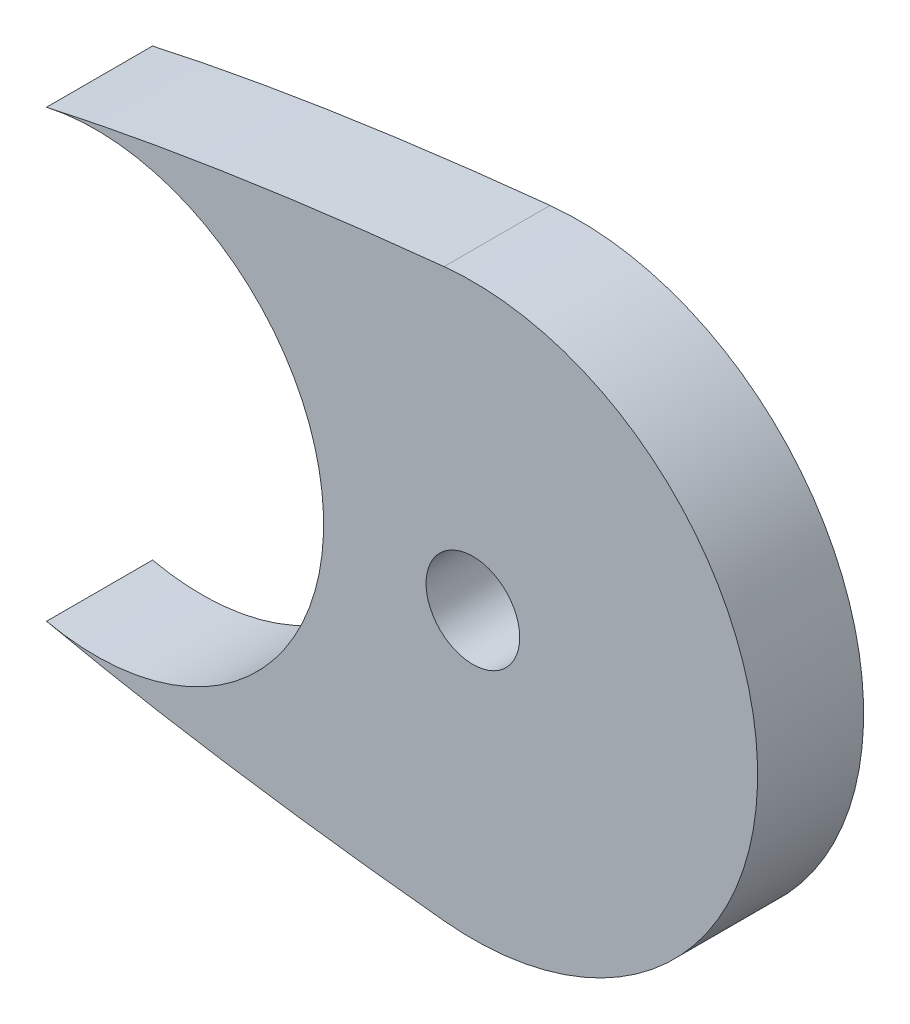
ISO-10303-21;
HEADER;
FILE_DESCRIPTION(('STEP AP214'),'2;1');
FILE_NAME('part.step','',(''),(''),'','','');
FILE_SCHEMA(('AUTOMOTIVE_DESIGN { 1 0 10303 214 1 1 1 1 }'));
ENDSEC;
DATA;
#1=APPLICATION_CONTEXT('core data for automotive mechanical design processes');
#2=APPLICATION_PROTOCOL_DEFINITION('international standard','automotive_design',2000,#1);
#3=PRODUCT_CONTEXT('',#1,'mechanical');
#4=PRODUCT('Part','Part','',(#3));
#5=PRODUCT_RELATED_PRODUCT_CATEGORY('part','',(#4));
#6=PRODUCT_DEFINITION_FORMATION('','',#4);
#7=PRODUCT_DEFINITION_CONTEXT('part definition',#1,'design');
#8=PRODUCT_DEFINITION('design','',#6,#7);
#9=PRODUCT_DEFINITION_SHAPE('','',#8);
#10=(LENGTH_UNIT() NAMED_UNIT(*) SI_UNIT(.MILLI.,.METRE.));
#11=(NAMED_UNIT(*) PLANE_ANGLE_UNIT() SI_UNIT($,.RADIAN.));
#12=(NAMED_UNIT(*) SI_UNIT($,.STERADIAN.) SOLID_ANGLE_UNIT());
#13=UNCERTAINTY_MEASURE_WITH_UNIT(LENGTH_MEASURE(1.E-05),#10,'distance_accuracy_value','');
#14=(GEOMETRIC_REPRESENTATION_CONTEXT(3) GLOBAL_UNCERTAINTY_ASSIGNED_CONTEXT((#13)) GLOBAL_UNIT_ASSIGNED_CONTEXT((#10,
#11,#12)) REPRESENTATION_CONTEXT('',''));
#15=CARTESIAN_POINT('',(0.,0.,0.));
#16=DIRECTION('',(0.,0.,1.));
#17=DIRECTION('',(1.,0.,0.));
#18=AXIS2_PLACEMENT_3D('',#15,#16,#17);
#19=CARTESIAN_POINT('',(46.6322388953236,0.,6.));
#20=DIRECTION('',(0.,0.,-1.));
#21=DIRECTION('',(-1.,0.,0.));
#22=AXIS2_PLACEMENT_3D('',#19,#20,#21);
#23=CYLINDRICAL_SURFACE('',#22,16.1182550375673);
#24=CARTESIAN_POINT('',(46.6322388953236,0.,0.));
#25=DIRECTION('',(0.,0.,1.));
#26=DIRECTION('',(1.,0.,0.));
#27=AXIS2_PLACEMENT_3D('',#24,#25,#26);
#28=CIRCLE('',#27,16.1182550375673);
#29=CARTESIAN_POINT('',(45.,-16.0353965228383,0.));
#30=VERTEX_POINT('',#29);
#31=CARTESIAN_POINT('',(45.,16.0353965228383,0.));
#32=VERTEX_POINT('',#31);
#33=EDGE_CURVE('E141',#30,#32,#28,.T.);
#34=ORIENTED_EDGE('',*,*,#33,.T.);
#35=DIRECTION('',(0.,0.,-1.));
#36=VECTOR('',#35,1.);
#37=CARTESIAN_POINT('',(45.,16.0353965228383,6.));
#38=LINE('',#37,#36);
#39=CARTESIAN_POINT('',(45.,16.0353965228383,6.));
#40=VERTEX_POINT('',#39);
#41=EDGE_CURVE('E11',#40,#32,#38,.T.);
#42=ORIENTED_EDGE('',*,*,#41,.F.);
#43=CARTESIAN_POINT('',(46.6322388953236,0.,6.));
#44=DIRECTION('',(0.,0.,1.));
#45=DIRECTION('',(1.,0.,0.));
#46=AXIS2_PLACEMENT_3D('',#43,#44,#45);
#47=CIRCLE('',#46,16.1182550375673);
#48=CARTESIAN_POINT('',(45.,-16.0353965228383,6.));
#49=VERTEX_POINT('',#48);
#50=EDGE_CURVE('E98',#49,#40,#47,.T.);
#51=ORIENTED_EDGE('',*,*,#50,.F.);
#52=DIRECTION('',(0.,0.,-1.));
#53=VECTOR('',#52,1.);
#54=CARTESIAN_POINT('',(45.,-16.0353965228383,6.));
#55=LINE('',#54,#53);
#56=EDGE_CURVE('E142',#49,#30,#55,.T.);
#57=ORIENTED_EDGE('',*,*,#56,.T.);
#58=EDGE_LOOP('',(#34,#42,#51,#57));
#59=FACE_BOUND('',#58,.T.);
#60=ADVANCED_FACE('F45',(#59),#23,.T.);
#61=CARTESIAN_POINT('',(300.,0.378,6.));
#62=CARTESIAN_POINT('',(299.845901447221,0.39961034336831,6.));
#63=CARTESIAN_POINT('',(299.230346714046,0.48593399083917,6.));
#64=CARTESIAN_POINT('',(297.848901683276,0.678531057447331,6.));
#65=CARTESIAN_POINT('',(295.556029122455,0.996787499241564,6.));
#66=CARTESIAN_POINT('',(292.365739581197,1.43343203295321,6.));
#67=CARTESIAN_POINT('',(288.297856433401,1.98344889126347,6.));
#68=CARTESIAN_POINT('',(283.377248038078,2.63572648359042,6.));
#69=CARTESIAN_POINT('',(277.63430498472,3.38149178862329,6.));
#70=CARTESIAN_POINT('',(271.104515413466,4.20901604095742,6.));
#71=CARTESIAN_POINT('',(263.828064626846,5.10718872872647,6.));
#72=CARTESIAN_POINT('',(255.849823781818,6.06276893212352,6.));
#73=CARTESIAN_POINT('',(247.21903434379,7.06424307195608,6.));
#74=CARTESIAN_POINT('',(237.988783489903,8.09787318806774,6.));
#75=CARTESIAN_POINT('',(228.216029511608,9.15107036010328,6.));
#76=CARTESIAN_POINT('',(217.961088379031,10.2107446574668,6.));
#77=CARTESIAN_POINT('',(207.287161839572,11.2632209265187,6.));
#78=CARTESIAN_POINT('',(196.260086850424,12.2937248064858,6.));
#79=CARTESIAN_POINT('',(184.947773044503,13.2887281219597,6.));
#80=CARTESIAN_POINT('',(173.420088229148,14.2315961384787,6.));
#81=CARTESIAN_POINT('',(161.747864995533,15.1069553720124,6.));
#82=CARTESIAN_POINT('',(150.00317252135,15.8985540753976,6.));
#83=CARTESIAN_POINT('',(138.258374542497,16.5898406039741,6.));
#84=CARTESIAN_POINT('',(126.585774705795,17.1633504747405,6.));
#85=CARTESIAN_POINT('',(115.057462615139,17.6037905135667,6.));
#86=CARTESIAN_POINT('',(103.744181572864,17.8967919128621,6.));
#87=CARTESIAN_POINT('',(92.7158453472272,18.0280433746414,6.));
#88=CARTESIAN_POINT('',(82.0402185013839,17.9871287273908,6.));
#89=CARTESIAN_POINT('',(71.7831190583338,17.7661449762132,6.));
#90=CARTESIAN_POINT('',(62.0076841473254,17.3594904245971,6.));
#91=CARTESIAN_POINT('',(52.7740834437817,16.7661013276277,6.));
#92=CARTESIAN_POINT('',(44.1390669938569,15.987763153894,6.));
#93=CARTESIAN_POINT('',(36.1554749512941,15.0305547578774,6.));
#94=CARTESIAN_POINT('',(28.8719698679608,13.9026205663682,6.));
#95=CARTESIAN_POINT('',(22.3326880228315,12.6157408879695,6.));
#96=CARTESIAN_POINT('',(16.5759570466198,11.1844668147641,6.));
#97=CARTESIAN_POINT('',(11.6344891822112,9.62275505380201,6.));
#98=CARTESIAN_POINT('',(7.53339032845527,7.94515078115887,6.));
#99=CARTESIAN_POINT('',(4.28573900369485,6.16300377839948,6.));
#100=CARTESIAN_POINT('',(1.8965325692393,4.27279663699588,6.));
#101=CARTESIAN_POINT('',(0.366265286449645,2.2288009510305,6.));
#102=CARTESIAN_POINT('',(-0.170692645797294,0.,6.));
#103=CARTESIAN_POINT('',(0.366265286449666,-2.22880095103055,6.));
#104=CARTESIAN_POINT('',(1.89653256923925,-4.27279663699582,6.));
#105=CARTESIAN_POINT('',(4.28573900369493,-6.16300377839955,6.));
#106=CARTESIAN_POINT('',(7.53339032845521,-7.94515078115883,6.));
#107=CARTESIAN_POINT('',(11.6344891822112,-9.62275505380201,6.));
#108=CARTESIAN_POINT('',(16.5759570466199,-11.1844668147641,6.));
#109=CARTESIAN_POINT('',(22.3326880228314,-12.6157408879695,6.));
#110=CARTESIAN_POINT('',(28.8719698679608,-13.9026205663682,6.));
#111=CARTESIAN_POINT('',(36.155474951294,-15.0305547578773,6.));
#112=CARTESIAN_POINT('',(44.1390669938569,-15.987763153894,6.));
#113=CARTESIAN_POINT('',(52.7740834437817,-16.7661013276277,6.));
#114=CARTESIAN_POINT('',(62.0076841473254,-17.3594904245971,6.));
#115=CARTESIAN_POINT('',(71.7831190583338,-17.7661449762132,6.));
#116=CARTESIAN_POINT('',(82.0402185013839,-17.9871287273908,6.));
#117=CARTESIAN_POINT('',(92.7158453472273,-18.0280433746414,6.));
#118=CARTESIAN_POINT('',(103.744181572864,-17.8967919128621,6.));
#119=CARTESIAN_POINT('',(115.057462615139,-17.6037905135667,6.));
#120=CARTESIAN_POINT('',(126.585774705795,-17.1633504747405,6.));
#121=CARTESIAN_POINT('',(138.258374542497,-16.5898406039741,6.));
#122=CARTESIAN_POINT('',(150.00317252135,-15.8985540753976,6.));
#123=CARTESIAN_POINT('',(161.747864995533,-15.1069553720124,6.));
#124=CARTESIAN_POINT('',(173.420088229148,-14.2315961384787,6.));
#125=CARTESIAN_POINT('',(184.947773044503,-13.2887281219597,6.));
#126=CARTESIAN_POINT('',(196.260086850424,-12.2937248064858,6.));
#127=CARTESIAN_POINT('',(207.287161839572,-11.2632209265187,6.));
#128=CARTESIAN_POINT('',(217.961088379031,-10.2107446574668,6.));
#129=CARTESIAN_POINT('',(228.216029511608,-9.15107036010328,6.));
#130=CARTESIAN_POINT('',(237.988783489903,-8.09787318806774,6.));
#131=CARTESIAN_POINT('',(247.21903434379,-7.06424307195608,6.));
#132=CARTESIAN_POINT('',(255.849823781818,-6.0627689321235,6.));
#133=CARTESIAN_POINT('',(263.828064626846,-5.10718872872648,6.));
#134=CARTESIAN_POINT('',(271.104515413466,-4.20901604095741,6.));
#135=CARTESIAN_POINT('',(277.63430498472,-3.38149178862329,6.));
#136=CARTESIAN_POINT('',(283.377248038078,-2.63572648359043,6.));
#137=CARTESIAN_POINT('',(288.297856433401,-1.98344889126346,6.));
#138=CARTESIAN_POINT('',(292.365739581198,-1.43343203295321,6.));
#139=CARTESIAN_POINT('',(295.556029122455,-0.996787499241567,6.));
#140=CARTESIAN_POINT('',(297.848901683276,-0.678531057447318,6.));
#141=CARTESIAN_POINT('',(299.230346714046,-0.48593399083919,6.));
#142=CARTESIAN_POINT('',(299.845901447221,-0.399610343368311,6.));
#143=CARTESIAN_POINT('',(300.,-0.378,6.));
#144=B_SPLINE_CURVE_WITH_KNOTS('',3,(#61,#62,#63,#64,#65,#66,#67,#68,#69,#70,#71,#72,#73,#74,
#75,#76,#77,#78,#79,#80,#81,#82,#83,#84,#85,#86,#87,#88,#89,#90,#91,#92,#93,#94,#95,#96,#97,#98,
#99,#100,#101,#102,#103,#104,#105,#106,#107,#108,#109,#110,#111,#112,#113,#114,#115,#116,#117,
#118,#119,#120,#121,#122,#123,#124,#125,#126,#127,#128,#129,#130,#131,#132,#133,#134,#135,#136,
#137,#138,#139,#140,#141,#142,#143),.UNSPECIFIED.,.F.,.F.,(4,1,1,1,1,1,1,1,1,1,1,1,1,1,1,1,1,1,
1,1,1,1,1,1,1,1,1,1,1,1,1,1,1,1,1,1,1,1,1,1,1,1,1,1,1,1,1,1,1,1,1,1,1,1,1,1,1,1,1,1,1,1,1,1,1,1,
1,1,1,1,1,1,1,1,1,1,1,1,1,1,4),(0.,0.000763156679271448,0.00304846929193477,0.00684068957953669,
0.0121161317605396,0.0188407924276644,0.0269727495182071,0.0364598537113803,0.0472429445210447,
0.0592535547279477,0.0724172643119224,0.0866510217067198,0.101866322474926,0.117968955401192,
0.134857918638583,0.152428309483259,0.170571841082248,0.189174521814913,0.208122338288737,
0.227296649324545,0.246580070424687,0.265853108019993,0.284996761496293,0.303895241632262,
0.322432580929281,0.340498658943124,0.357984483489282,0.37478811429809,0.390812303248415,
0.405965006366899,0.420162443159487,0.433328264782086,0.445393603392471,0.456301171479378,
0.466003880875037,0.474472000637231,0.481696232103684,0.487703697963338,0.492583405321472,
0.496543603187854,0.5,0.503456396812145,0.507416594678528,0.512296302036662,0.518303767896316,
0.525527999362769,0.533996119124963,0.543698828520622,0.554606396607529,0.566671735217914,
0.579837556840513,0.594034993633101,0.609187696751585,0.62521188570191,0.642015516510718,
0.659501341056876,0.677567419070719,0.696104758367738,0.715003238503707,0.734146891980006,
0.753419929575313,0.772703350675454,0.791877661711263,0.810825478185087,0.829428158917752,
0.847571690516741,0.865142081361417,0.882031044598807,0.898133677525074,0.91334897829328,
0.927582735688077,0.940746445272052,0.952757055478955,0.96354014628862,0.973027250481793,
0.981159207572336,0.98788386823946,0.993159310420463,0.996951530708065,0.999236843320729,1.),.UNSPECIFIED.);
#145=DIRECTION('',(0.,0.,-1.));
#146=VECTOR('',#145,1.);
#147=SURFACE_OF_LINEAR_EXTRUSION('',#144,#146);
#148=CARTESIAN_POINT('',(300.,0.378,0.));
#149=CARTESIAN_POINT('',(299.845901447221,0.39961034336831,0.));
#150=CARTESIAN_POINT('',(299.230346714046,0.48593399083917,0.));
#151=CARTESIAN_POINT('',(297.848901683276,0.678531057447331,0.));
#152=CARTESIAN_POINT('',(295.556029122455,0.996787499241564,0.));
#153=CARTESIAN_POINT('',(292.365739581197,1.43343203295321,0.));
#154=CARTESIAN_POINT('',(288.297856433401,1.98344889126347,0.));
#155=CARTESIAN_POINT('',(283.377248038078,2.63572648359042,0.));
#156=CARTESIAN_POINT('',(277.63430498472,3.38149178862329,0.));
#157=CARTESIAN_POINT('',(271.104515413466,4.20901604095742,0.));
#158=CARTESIAN_POINT('',(263.828064626846,5.10718872872647,0.));
#159=CARTESIAN_POINT('',(255.849823781818,6.06276893212352,0.));
#160=CARTESIAN_POINT('',(247.21903434379,7.06424307195608,0.));
#161=CARTESIAN_POINT('',(237.988783489903,8.09787318806774,0.));
#162=CARTESIAN_POINT('',(228.216029511608,9.15107036010328,0.));
#163=CARTESIAN_POINT('',(217.961088379031,10.2107446574668,0.));
#164=CARTESIAN_POINT('',(207.287161839572,11.2632209265187,0.));
#165=CARTESIAN_POINT('',(196.260086850424,12.2937248064858,0.));
#166=CARTESIAN_POINT('',(184.947773044503,13.2887281219597,0.));
#167=CARTESIAN_POINT('',(173.420088229148,14.2315961384787,0.));
#168=CARTESIAN_POINT('',(161.747864995533,15.1069553720124,0.));
#169=CARTESIAN_POINT('',(150.00317252135,15.8985540753976,0.));
#170=CARTESIAN_POINT('',(138.258374542497,16.5898406039741,0.));
#171=CARTESIAN_POINT('',(126.585774705795,17.1633504747405,0.));
#172=CARTESIAN_POINT('',(115.057462615139,17.6037905135667,0.));
#173=CARTESIAN_POINT('',(103.744181572864,17.8967919128621,0.));
#174=CARTESIAN_POINT('',(92.7158453472272,18.0280433746414,0.));
#175=CARTESIAN_POINT('',(82.0402185013839,17.9871287273908,0.));
#176=CARTESIAN_POINT('',(71.7831190583338,17.7661449762132,0.));
#177=CARTESIAN_POINT('',(62.0076841473254,17.3594904245971,0.));
#178=CARTESIAN_POINT('',(52.7740834437817,16.7661013276277,0.));
#179=CARTESIAN_POINT('',(44.1390669938569,15.987763153894,0.));
#180=CARTESIAN_POINT('',(36.1554749512941,15.0305547578774,0.));
#181=CARTESIAN_POINT('',(28.8719698679608,13.9026205663682,0.));
#182=CARTESIAN_POINT('',(22.3326880228315,12.6157408879695,0.));
#183=CARTESIAN_POINT('',(16.5759570466198,11.1844668147641,0.));
#184=CARTESIAN_POINT('',(11.6344891822112,9.62275505380201,0.));
#185=CARTESIAN_POINT('',(7.53339032845527,7.94515078115887,0.));
#186=CARTESIAN_POINT('',(4.28573900369485,6.16300377839948,0.));
#187=CARTESIAN_POINT('',(1.8965325692393,4.27279663699588,0.));
#188=CARTESIAN_POINT('',(0.366265286449645,2.2288009510305,0.));
#189=CARTESIAN_POINT('',(-0.170692645797294,0.,0.));
#190=CARTESIAN_POINT('',(0.366265286449666,-2.22880095103055,0.));
#191=CARTESIAN_POINT('',(1.89653256923925,-4.27279663699582,0.));
#192=CARTESIAN_POINT('',(4.28573900369493,-6.16300377839955,0.));
#193=CARTESIAN_POINT('',(7.53339032845521,-7.94515078115883,0.));
#194=CARTESIAN_POINT('',(11.6344891822112,-9.62275505380201,0.));
#195=CARTESIAN_POINT('',(16.5759570466199,-11.1844668147641,0.));
#196=CARTESIAN_POINT('',(22.3326880228314,-12.6157408879695,0.));
#197=CARTESIAN_POINT('',(28.8719698679608,-13.9026205663682,0.));
#198=CARTESIAN_POINT('',(36.155474951294,-15.0305547578773,0.));
#199=CARTESIAN_POINT('',(44.1390669938569,-15.987763153894,0.));
#200=CARTESIAN_POINT('',(52.7740834437817,-16.7661013276277,0.));
#201=CARTESIAN_POINT('',(62.0076841473254,-17.3594904245971,0.));
#202=CARTESIAN_POINT('',(71.7831190583338,-17.7661449762132,0.));
#203=CARTESIAN_POINT('',(82.0402185013839,-17.9871287273908,0.));
#204=CARTESIAN_POINT('',(92.7158453472273,-18.0280433746414,0.));
#205=CARTESIAN_POINT('',(103.744181572864,-17.8967919128621,0.));
#206=CARTESIAN_POINT('',(115.057462615139,-17.6037905135667,0.));
#207=CARTESIAN_POINT('',(126.585774705795,-17.1633504747405,0.));
#208=CARTESIAN_POINT('',(138.258374542497,-16.5898406039741,0.));
#209=CARTESIAN_POINT('',(150.00317252135,-15.8985540753976,0.));
#210=CARTESIAN_POINT('',(161.747864995533,-15.1069553720124,0.));
#211=CARTESIAN_POINT('',(173.420088229148,-14.2315961384787,0.));
#212=CARTESIAN_POINT('',(184.947773044503,-13.2887281219597,0.));
#213=CARTESIAN_POINT('',(196.260086850424,-12.2937248064858,0.));
#214=CARTESIAN_POINT('',(207.287161839572,-11.2632209265187,0.));
#215=CARTESIAN_POINT('',(217.961088379031,-10.2107446574668,0.));
#216=CARTESIAN_POINT('',(228.216029511608,-9.15107036010328,0.));
#217=CARTESIAN_POINT('',(237.988783489903,-8.09787318806774,0.));
#218=CARTESIAN_POINT('',(247.21903434379,-7.06424307195608,0.));
#219=CARTESIAN_POINT('',(255.849823781818,-6.0627689321235,0.));
#220=CARTESIAN_POINT('',(263.828064626846,-5.10718872872648,0.));
#221=CARTESIAN_POINT('',(271.104515413466,-4.20901604095741,0.));
#222=CARTESIAN_POINT('',(277.63430498472,-3.38149178862329,0.));
#223=CARTESIAN_POINT('',(283.377248038078,-2.63572648359043,0.));
#224=CARTESIAN_POINT('',(288.297856433401,-1.98344889126346,0.));
#225=CARTESIAN_POINT('',(292.365739581198,-1.43343203295321,0.));
#226=CARTESIAN_POINT('',(295.556029122455,-0.996787499241567,0.));
#227=CARTESIAN_POINT('',(297.848901683276,-0.678531057447318,0.));
#228=CARTESIAN_POINT('',(299.230346714046,-0.48593399083919,0.));
#229=CARTESIAN_POINT('',(299.845901447221,-0.399610343368311,0.));
#230=CARTESIAN_POINT('',(300.,-0.378,0.));
#231=B_SPLINE_CURVE_WITH_KNOTS('',3,(#148,#149,#150,#151,#152,#153,#154,#155,#156,#157,#158,
#159,#160,#161,#162,#163,#164,#165,#166,#167,#168,#169,#170,#171,#172,#173,#174,#175,#176,#177,
#178,#179,#180,#181,#182,#183,#184,#185,#186,#187,#188,#189,#190,#191,#192,#193,#194,#195,#196,
#197,#198,#199,#200,#201,#202,#203,#204,#205,#206,#207,#208,#209,#210,#211,#212,#213,#214,#215,
#216,#217,#218,#219,#220,#221,#222,#223,#224,#225,#226,#227,#228,#229,#230),.UNSPECIFIED.,.F.,
.F.,(4,1,1,1,1,1,1,1,1,1,1,1,1,1,1,1,1,1,1,1,1,1,1,1,1,1,1,1,1,1,1,1,1,1,1,1,1,1,1,1,1,1,1,1,1,
1,1,1,1,1,1,1,1,1,1,1,1,1,1,1,1,1,1,1,1,1,1,1,1,1,1,1,1,1,1,1,1,1,1,1,4),(0.,
0.000763156679271448,0.00304846929193477,0.00684068957953669,0.0121161317605396,
0.0188407924276644,0.0269727495182071,0.0364598537113803,0.0472429445210447,0.0592535547279477,
0.0724172643119224,0.0866510217067198,0.101866322474926,0.117968955401192,0.134857918638583,
0.152428309483259,0.170571841082248,0.189174521814913,0.208122338288737,0.227296649324545,
0.246580070424687,0.265853108019993,0.284996761496293,0.303895241632262,0.322432580929281,
0.340498658943124,0.357984483489282,0.37478811429809,0.390812303248415,0.405965006366899,
0.420162443159487,0.433328264782086,0.445393603392471,0.456301171479378,0.466003880875037,
0.474472000637231,0.481696232103684,0.487703697963338,0.492583405321472,0.496543603187854,0.5,
0.503456396812145,0.507416594678528,0.512296302036662,0.518303767896316,0.525527999362769,
0.533996119124963,0.543698828520622,0.554606396607529,0.566671735217914,0.579837556840513,
0.594034993633101,0.609187696751585,0.62521188570191,0.642015516510718,0.659501341056876,
0.677567419070719,0.696104758367738,0.715003238503707,0.734146891980006,0.753419929575313,
0.772703350675454,0.791877661711263,0.810825478185087,0.829428158917752,0.847571690516741,
0.865142081361417,0.882031044598807,0.898133677525074,0.91334897829328,0.927582735688077,
0.940746445272052,0.952757055478955,0.96354014628862,0.973027250481793,0.981159207572336,
0.98788386823946,0.993159310420463,0.996951530708065,0.999236843320729,1.),.UNSPECIFIED.);
#232=CARTESIAN_POINT('',(22.4999999999996,12.5995803532421,0.));
#233=VERTEX_POINT('',#232);
#234=EDGE_CURVE('E103',#32,#233,#231,.T.);
#235=ORIENTED_EDGE('',*,*,#234,.T.);
#236=DIRECTION('',(0.,0.,-1.));
#237=VECTOR('',#236,1.);
#238=CARTESIAN_POINT('',(22.4999999999996,12.5995803532421,6.));
#239=LINE('',#238,#237);
#240=CARTESIAN_POINT('',(22.4999999999996,12.5995803532421,6.));
#241=VERTEX_POINT('',#240);
#242=EDGE_CURVE('E54',#241,#233,#239,.T.);
#243=ORIENTED_EDGE('',*,*,#242,.F.);
#244=EDGE_CURVE('E92',#40,#241,#144,.T.);
#245=ORIENTED_EDGE('',*,*,#244,.F.);
#246=ORIENTED_EDGE('',*,*,#41,.T.);
#247=EDGE_LOOP('',(#235,#243,#245,#246));
#248=FACE_BOUND('',#247,.T.);
#249=ADVANCED_FACE('F102',(#248),#147,.F.);
#250=CARTESIAN_POINT('',(25.2816825118978,0.,6.));
#251=DIRECTION('',(0.,0.,-1.));
#252=DIRECTION('',(-1.,0.,0.));
#253=AXIS2_PLACEMENT_3D('',#250,#251,#252);
#254=CYLINDRICAL_SURFACE('',#253,12.9029912297422);
#255=CARTESIAN_POINT('',(25.2816825118978,0.,0.));
#256=DIRECTION('',(0.,0.,1.));
#257=DIRECTION('',(1.,0.,0.));
#258=AXIS2_PLACEMENT_3D('',#255,#256,#257);
#259=CIRCLE('',#258,12.9029912297422);
#260=CARTESIAN_POINT('',(22.4999999999997,-12.5995803532421,0.));
#261=VERTEX_POINT('',#260);
#262=EDGE_CURVE('E79',#233,#261,#259,.F.);
#263=ORIENTED_EDGE('',*,*,#262,.T.);
#264=DIRECTION('',(0.,0.,-1.));
#265=VECTOR('',#264,1.);
#266=CARTESIAN_POINT('',(22.4999999999997,-12.5995803532421,6.));
#267=LINE('',#266,#265);
#268=CARTESIAN_POINT('',(22.4999999999997,-12.5995803532421,6.));
#269=VERTEX_POINT('',#268);
#270=EDGE_CURVE('E105',#269,#261,#267,.T.);
#271=ORIENTED_EDGE('',*,*,#270,.F.);
#272=CARTESIAN_POINT('',(25.2816825118978,0.,6.));
#273=DIRECTION('',(0.,0.,1.));
#274=DIRECTION('',(1.,0.,0.));
#275=AXIS2_PLACEMENT_3D('',#272,#273,#274);
#276=CIRCLE('',#275,12.9029912297422);
#277=EDGE_CURVE('E96',#241,#269,#276,.F.);
#278=ORIENTED_EDGE('',*,*,#277,.F.);
#279=ORIENTED_EDGE('',*,*,#242,.T.);
#280=EDGE_LOOP('',(#263,#271,#278,#279));
#281=FACE_BOUND('',#280,.T.);
#282=ADVANCED_FACE('F106',(#281),#254,.F.);
#283=CARTESIAN_POINT('',(300.,0.378,6.));
#284=CARTESIAN_POINT('',(299.845901447221,0.39961034336831,6.));
#285=CARTESIAN_POINT('',(299.230346714046,0.48593399083917,6.));
#286=CARTESIAN_POINT('',(297.848901683276,0.678531057447331,6.));
#287=CARTESIAN_POINT('',(295.556029122455,0.996787499241564,6.));
#288=CARTESIAN_POINT('',(292.365739581197,1.43343203295321,6.));
#289=CARTESIAN_POINT('',(288.297856433401,1.98344889126347,6.));
#290=CARTESIAN_POINT('',(283.377248038078,2.63572648359042,6.));
#291=CARTESIAN_POINT('',(277.63430498472,3.38149178862329,6.));
#292=CARTESIAN_POINT('',(271.104515413466,4.20901604095742,6.));
#293=CARTESIAN_POINT('',(263.828064626846,5.10718872872647,6.));
#294=CARTESIAN_POINT('',(255.849823781818,6.06276893212352,6.));
#295=CARTESIAN_POINT('',(247.21903434379,7.06424307195608,6.));
#296=CARTESIAN_POINT('',(237.988783489903,8.09787318806774,6.));
#297=CARTESIAN_POINT('',(228.216029511608,9.15107036010328,6.));
#298=CARTESIAN_POINT('',(217.961088379031,10.2107446574668,6.));
#299=CARTESIAN_POINT('',(207.287161839572,11.2632209265187,6.));
#300=CARTESIAN_POINT('',(196.260086850424,12.2937248064858,6.));
#301=CARTESIAN_POINT('',(184.947773044503,13.2887281219597,6.));
#302=CARTESIAN_POINT('',(173.420088229148,14.2315961384787,6.));
#303=CARTESIAN_POINT('',(161.747864995533,15.1069553720124,6.));
#304=CARTESIAN_POINT('',(150.00317252135,15.8985540753976,6.));
#305=CARTESIAN_POINT('',(138.258374542497,16.5898406039741,6.));
#306=CARTESIAN_POINT('',(126.585774705795,17.1633504747405,6.));
#307=CARTESIAN_POINT('',(115.057462615139,17.6037905135667,6.));
#308=CARTESIAN_POINT('',(103.744181572864,17.8967919128621,6.));
#309=CARTESIAN_POINT('',(92.7158453472272,18.0280433746414,6.));
#310=CARTESIAN_POINT('',(82.0402185013839,17.9871287273908,6.));
#311=CARTESIAN_POINT('',(71.7831190583338,17.7661449762132,6.));
#312=CARTESIAN_POINT('',(62.0076841473254,17.3594904245971,6.));
#313=CARTESIAN_POINT('',(52.7740834437817,16.7661013276277,6.));
#314=CARTESIAN_POINT('',(44.1390669938569,15.987763153894,6.));
#315=CARTESIAN_POINT('',(36.1554749512941,15.0305547578774,6.));
#316=CARTESIAN_POINT('',(28.8719698679608,13.9026205663682,6.));
#317=CARTESIAN_POINT('',(22.3326880228315,12.6157408879695,6.));
#318=CARTESIAN_POINT('',(16.5759570466198,11.1844668147641,6.));
#319=CARTESIAN_POINT('',(11.6344891822112,9.62275505380201,6.));
#320=CARTESIAN_POINT('',(7.53339032845527,7.94515078115887,6.));
#321=CARTESIAN_POINT('',(4.28573900369485,6.16300377839948,6.));
#322=CARTESIAN_POINT('',(1.8965325692393,4.27279663699588,6.));
#323=CARTESIAN_POINT('',(0.366265286449645,2.2288009510305,6.));
#324=CARTESIAN_POINT('',(-0.170692645797294,0.,6.));
#325=CARTESIAN_POINT('',(0.366265286449666,-2.22880095103055,6.));
#326=CARTESIAN_POINT('',(1.89653256923925,-4.27279663699582,6.));
#327=CARTESIAN_POINT('',(4.28573900369493,-6.16300377839955,6.));
#328=CARTESIAN_POINT('',(7.53339032845521,-7.94515078115883,6.));
#329=CARTESIAN_POINT('',(11.6344891822112,-9.62275505380201,6.));
#330=CARTESIAN_POINT('',(16.5759570466199,-11.1844668147641,6.));
#331=CARTESIAN_POINT('',(22.3326880228314,-12.6157408879695,6.));
#332=CARTESIAN_POINT('',(28.8719698679608,-13.9026205663682,6.));
#333=CARTESIAN_POINT('',(36.155474951294,-15.0305547578773,6.));
#334=CARTESIAN_POINT('',(44.1390669938569,-15.987763153894,6.));
#335=CARTESIAN_POINT('',(52.7740834437817,-16.7661013276277,6.));
#336=CARTESIAN_POINT('',(62.0076841473254,-17.3594904245971,6.));
#337=CARTESIAN_POINT('',(71.7831190583338,-17.7661449762132,6.));
#338=CARTESIAN_POINT('',(82.0402185013839,-17.9871287273908,6.));
#339=CARTESIAN_POINT('',(92.7158453472273,-18.0280433746414,6.));
#340=CARTESIAN_POINT('',(103.744181572864,-17.8967919128621,6.));
#341=CARTESIAN_POINT('',(115.057462615139,-17.6037905135667,6.));
#342=CARTESIAN_POINT('',(126.585774705795,-17.1633504747405,6.));
#343=CARTESIAN_POINT('',(138.258374542497,-16.5898406039741,6.));
#344=CARTESIAN_POINT('',(150.00317252135,-15.8985540753976,6.));
#345=CARTESIAN_POINT('',(161.747864995533,-15.1069553720124,6.));
#346=CARTESIAN_POINT('',(173.420088229148,-14.2315961384787,6.));
#347=CARTESIAN_POINT('',(184.947773044503,-13.2887281219597,6.));
#348=CARTESIAN_POINT('',(196.260086850424,-12.2937248064858,6.));
#349=CARTESIAN_POINT('',(207.287161839572,-11.2632209265187,6.));
#350=CARTESIAN_POINT('',(217.961088379031,-10.2107446574668,6.));
#351=CARTESIAN_POINT('',(228.216029511608,-9.15107036010328,6.));
#352=CARTESIAN_POINT('',(237.988783489903,-8.09787318806774,6.));
#353=CARTESIAN_POINT('',(247.21903434379,-7.06424307195608,6.));
#354=CARTESIAN_POINT('',(255.849823781818,-6.0627689321235,6.));
#355=CARTESIAN_POINT('',(263.828064626846,-5.10718872872648,6.));
#356=CARTESIAN_POINT('',(271.104515413466,-4.20901604095741,6.));
#357=CARTESIAN_POINT('',(277.63430498472,-3.38149178862329,6.));
#358=CARTESIAN_POINT('',(283.377248038078,-2.63572648359043,6.));
#359=CARTESIAN_POINT('',(288.297856433401,-1.98344889126346,6.));
#360=CARTESIAN_POINT('',(292.365739581198,-1.43343203295321,6.));
#361=CARTESIAN_POINT('',(295.556029122455,-0.996787499241567,6.));
#362=CARTESIAN_POINT('',(297.848901683276,-0.678531057447318,6.));
#363=CARTESIAN_POINT('',(299.230346714046,-0.48593399083919,6.));
#364=CARTESIAN_POINT('',(299.845901447221,-0.399610343368311,6.));
#365=CARTESIAN_POINT('',(300.,-0.378,6.));
#366=B_SPLINE_CURVE_WITH_KNOTS('',3,(#283,#284,#285,#286,#287,#288,#289,#290,#291,#292,#293,
#294,#295,#296,#297,#298,#299,#300,#301,#302,#303,#304,#305,#306,#307,#308,#309,#310,#311,#312,
#313,#314,#315,#316,#317,#318,#319,#320,#321,#322,#323,#324,#325,#326,#327,#328,#329,#330,#331,
#332,#333,#334,#335,#336,#337,#338,#339,#340,#341,#342,#343,#344,#345,#346,#347,#348,#349,#350,
#351,#352,#353,#354,#355,#356,#357,#358,#359,#360,#361,#362,#363,#364,#365),.UNSPECIFIED.,.F.,
.F.,(4,1,1,1,1,1,1,1,1,1,1,1,1,1,1,1,1,1,1,1,1,1,1,1,1,1,1,1,1,1,1,1,1,1,1,1,1,1,1,1,1,1,1,1,1,
1,1,1,1,1,1,1,1,1,1,1,1,1,1,1,1,1,1,1,1,1,1,1,1,1,1,1,1,1,1,1,1,1,1,1,4),(0.,
0.000763156679271448,0.00304846929193477,0.00684068957953669,0.0121161317605396,
0.0188407924276644,0.0269727495182071,0.0364598537113803,0.0472429445210447,0.0592535547279477,
0.0724172643119224,0.0866510217067198,0.101866322474926,0.117968955401192,0.134857918638583,
0.152428309483259,0.170571841082248,0.189174521814913,0.208122338288737,0.227296649324545,
0.246580070424687,0.265853108019993,0.284996761496293,0.303895241632262,0.322432580929281,
0.340498658943124,0.357984483489282,0.37478811429809,0.390812303248415,0.405965006366899,
0.420162443159487,0.433328264782086,0.445393603392471,0.456301171479378,0.466003880875037,
0.474472000637231,0.481696232103684,0.487703697963338,0.492583405321472,0.496543603187854,0.5,
0.503456396812145,0.507416594678528,0.512296302036662,0.518303767896316,0.525527999362769,
0.533996119124963,0.543698828520622,0.554606396607529,0.566671735217914,0.579837556840513,
0.594034993633101,0.609187696751585,0.62521188570191,0.642015516510718,0.659501341056876,
0.677567419070719,0.696104758367738,0.715003238503707,0.734146891980006,0.753419929575313,
0.772703350675454,0.791877661711263,0.810825478185087,0.829428158917752,0.847571690516741,
0.865142081361417,0.882031044598807,0.898133677525074,0.91334897829328,0.927582735688077,
0.940746445272052,0.952757055478955,0.96354014628862,0.973027250481793,0.981159207572336,
0.98788386823946,0.993159310420463,0.996951530708065,0.999236843320729,1.),.UNSPECIFIED.);
#367=DIRECTION('',(0.,0.,-1.));
#368=VECTOR('',#367,1.);
#369=SURFACE_OF_LINEAR_EXTRUSION('',#366,#368);
#370=CARTESIAN_POINT('',(300.,0.378,0.));
#371=CARTESIAN_POINT('',(299.845901447221,0.39961034336831,0.));
#372=CARTESIAN_POINT('',(299.230346714046,0.48593399083917,0.));
#373=CARTESIAN_POINT('',(297.848901683276,0.678531057447331,0.));
#374=CARTESIAN_POINT('',(295.556029122455,0.996787499241564,0.));
#375=CARTESIAN_POINT('',(292.365739581197,1.43343203295321,0.));
#376=CARTESIAN_POINT('',(288.297856433401,1.98344889126347,0.));
#377=CARTESIAN_POINT('',(283.377248038078,2.63572648359042,0.));
#378=CARTESIAN_POINT('',(277.63430498472,3.38149178862329,0.));
#379=CARTESIAN_POINT('',(271.104515413466,4.20901604095742,0.));
#380=CARTESIAN_POINT('',(263.828064626846,5.10718872872647,0.));
#381=CARTESIAN_POINT('',(255.849823781818,6.06276893212352,0.));
#382=CARTESIAN_POINT('',(247.21903434379,7.06424307195608,0.));
#383=CARTESIAN_POINT('',(237.988783489903,8.09787318806774,0.));
#384=CARTESIAN_POINT('',(228.216029511608,9.15107036010328,0.));
#385=CARTESIAN_POINT('',(217.961088379031,10.2107446574668,0.));
#386=CARTESIAN_POINT('',(207.287161839572,11.2632209265187,0.));
#387=CARTESIAN_POINT('',(196.260086850424,12.2937248064858,0.));
#388=CARTESIAN_POINT('',(184.947773044503,13.2887281219597,0.));
#389=CARTESIAN_POINT('',(173.420088229148,14.2315961384787,0.));
#390=CARTESIAN_POINT('',(161.747864995533,15.1069553720124,0.));
#391=CARTESIAN_POINT('',(150.00317252135,15.8985540753976,0.));
#392=CARTESIAN_POINT('',(138.258374542497,16.5898406039741,0.));
#393=CARTESIAN_POINT('',(126.585774705795,17.1633504747405,0.));
#394=CARTESIAN_POINT('',(115.057462615139,17.6037905135667,0.));
#395=CARTESIAN_POINT('',(103.744181572864,17.8967919128621,0.));
#396=CARTESIAN_POINT('',(92.7158453472272,18.0280433746414,0.));
#397=CARTESIAN_POINT('',(82.0402185013839,17.9871287273908,0.));
#398=CARTESIAN_POINT('',(71.7831190583338,17.7661449762132,0.));
#399=CARTESIAN_POINT('',(62.0076841473254,17.3594904245971,0.));
#400=CARTESIAN_POINT('',(52.7740834437817,16.7661013276277,0.));
#401=CARTESIAN_POINT('',(44.1390669938569,15.987763153894,0.));
#402=CARTESIAN_POINT('',(36.1554749512941,15.0305547578774,0.));
#403=CARTESIAN_POINT('',(28.8719698679608,13.9026205663682,0.));
#404=CARTESIAN_POINT('',(22.3326880228315,12.6157408879695,0.));
#405=CARTESIAN_POINT('',(16.5759570466198,11.1844668147641,0.));
#406=CARTESIAN_POINT('',(11.6344891822112,9.62275505380201,0.));
#407=CARTESIAN_POINT('',(7.53339032845527,7.94515078115887,0.));
#408=CARTESIAN_POINT('',(4.28573900369485,6.16300377839948,0.));
#409=CARTESIAN_POINT('',(1.8965325692393,4.27279663699588,0.));
#410=CARTESIAN_POINT('',(0.366265286449645,2.2288009510305,0.));
#411=CARTESIAN_POINT('',(-0.170692645797294,0.,0.));
#412=CARTESIAN_POINT('',(0.366265286449666,-2.22880095103055,0.));
#413=CARTESIAN_POINT('',(1.89653256923925,-4.27279663699582,0.));
#414=CARTESIAN_POINT('',(4.28573900369493,-6.16300377839955,0.));
#415=CARTESIAN_POINT('',(7.53339032845521,-7.94515078115883,0.));
#416=CARTESIAN_POINT('',(11.6344891822112,-9.62275505380201,0.));
#417=CARTESIAN_POINT('',(16.5759570466199,-11.1844668147641,0.));
#418=CARTESIAN_POINT('',(22.3326880228314,-12.6157408879695,0.));
#419=CARTESIAN_POINT('',(28.8719698679608,-13.9026205663682,0.));
#420=CARTESIAN_POINT('',(36.155474951294,-15.0305547578773,0.));
#421=CARTESIAN_POINT('',(44.1390669938569,-15.987763153894,0.));
#422=CARTESIAN_POINT('',(52.7740834437817,-16.7661013276277,0.));
#423=CARTESIAN_POINT('',(62.0076841473254,-17.3594904245971,0.));
#424=CARTESIAN_POINT('',(71.7831190583338,-17.7661449762132,0.));
#425=CARTESIAN_POINT('',(82.0402185013839,-17.9871287273908,0.));
#426=CARTESIAN_POINT('',(92.7158453472273,-18.0280433746414,0.));
#427=CARTESIAN_POINT('',(103.744181572864,-17.8967919128621,0.));
#428=CARTESIAN_POINT('',(115.057462615139,-17.6037905135667,0.));
#429=CARTESIAN_POINT('',(126.585774705795,-17.1633504747405,0.));
#430=CARTESIAN_POINT('',(138.258374542497,-16.5898406039741,0.));
#431=CARTESIAN_POINT('',(150.00317252135,-15.8985540753976,0.));
#432=CARTESIAN_POINT('',(161.747864995533,-15.1069553720124,0.));
#433=CARTESIAN_POINT('',(173.420088229148,-14.2315961384787,0.));
#434=CARTESIAN_POINT('',(184.947773044503,-13.2887281219597,0.));
#435=CARTESIAN_POINT('',(196.260086850424,-12.2937248064858,0.));
#436=CARTESIAN_POINT('',(207.287161839572,-11.2632209265187,0.));
#437=CARTESIAN_POINT('',(217.961088379031,-10.2107446574668,0.));
#438=CARTESIAN_POINT('',(228.216029511608,-9.15107036010328,0.));
#439=CARTESIAN_POINT('',(237.988783489903,-8.09787318806774,0.));
#440=CARTESIAN_POINT('',(247.21903434379,-7.06424307195608,0.));
#441=CARTESIAN_POINT('',(255.849823781818,-6.0627689321235,0.));
#442=CARTESIAN_POINT('',(263.828064626846,-5.10718872872648,0.));
#443=CARTESIAN_POINT('',(271.104515413466,-4.20901604095741,0.));
#444=CARTESIAN_POINT('',(277.63430498472,-3.38149178862329,0.));
#445=CARTESIAN_POINT('',(283.377248038078,-2.63572648359043,0.));
#446=CARTESIAN_POINT('',(288.297856433401,-1.98344889126346,0.));
#447=CARTESIAN_POINT('',(292.365739581198,-1.43343203295321,0.));
#448=CARTESIAN_POINT('',(295.556029122455,-0.996787499241567,0.));
#449=CARTESIAN_POINT('',(297.848901683276,-0.678531057447318,0.));
#450=CARTESIAN_POINT('',(299.230346714046,-0.48593399083919,0.));
#451=CARTESIAN_POINT('',(299.845901447221,-0.399610343368311,0.));
#452=CARTESIAN_POINT('',(300.,-0.378,0.));
#453=B_SPLINE_CURVE_WITH_KNOTS('',3,(#370,#371,#372,#373,#374,#375,#376,#377,#378,#379,#380,
#381,#382,#383,#384,#385,#386,#387,#388,#389,#390,#391,#392,#393,#394,#395,#396,#397,#398,#399,
#400,#401,#402,#403,#404,#405,#406,#407,#408,#409,#410,#411,#412,#413,#414,#415,#416,#417,#418,
#419,#420,#421,#422,#423,#424,#425,#426,#427,#428,#429,#430,#431,#432,#433,#434,#435,#436,#437,
#438,#439,#440,#441,#442,#443,#444,#445,#446,#447,#448,#449,#450,#451,#452),.UNSPECIFIED.,.F.,
.F.,(4,1,1,1,1,1,1,1,1,1,1,1,1,1,1,1,1,1,1,1,1,1,1,1,1,1,1,1,1,1,1,1,1,1,1,1,1,1,1,1,1,1,1,1,1,
1,1,1,1,1,1,1,1,1,1,1,1,1,1,1,1,1,1,1,1,1,1,1,1,1,1,1,1,1,1,1,1,1,1,1,4),(0.,
0.000763156679271448,0.00304846929193477,0.00684068957953669,0.0121161317605396,
0.0188407924276644,0.0269727495182071,0.0364598537113803,0.0472429445210447,0.0592535547279477,
0.0724172643119224,0.0866510217067198,0.101866322474926,0.117968955401192,0.134857918638583,
0.152428309483259,0.170571841082248,0.189174521814913,0.208122338288737,0.227296649324545,
0.246580070424687,0.265853108019993,0.284996761496293,0.303895241632262,0.322432580929281,
0.340498658943124,0.357984483489282,0.37478811429809,0.390812303248415,0.405965006366899,
0.420162443159487,0.433328264782086,0.445393603392471,0.456301171479378,0.466003880875037,
0.474472000637231,0.481696232103684,0.487703697963338,0.492583405321472,0.496543603187854,0.5,
0.503456396812145,0.507416594678528,0.512296302036662,0.518303767896316,0.525527999362769,
0.533996119124963,0.543698828520622,0.554606396607529,0.566671735217914,0.579837556840513,
0.594034993633101,0.609187696751585,0.62521188570191,0.642015516510718,0.659501341056876,
0.677567419070719,0.696104758367738,0.715003238503707,0.734146891980006,0.753419929575313,
0.772703350675454,0.791877661711263,0.810825478185087,0.829428158917752,0.847571690516741,
0.865142081361417,0.882031044598807,0.898133677525074,0.91334897829328,0.927582735688077,
0.940746445272052,0.952757055478955,0.96354014628862,0.973027250481793,0.981159207572336,
0.98788386823946,0.993159310420463,0.996951530708065,0.999236843320729,1.),.UNSPECIFIED.);
#454=EDGE_CURVE('E85',#261,#30,#453,.T.);
#455=ORIENTED_EDGE('',*,*,#454,.T.);
#456=ORIENTED_EDGE('',*,*,#56,.F.);
#457=EDGE_CURVE('E62',#269,#49,#366,.T.);
#458=ORIENTED_EDGE('',*,*,#457,.F.);
#459=ORIENTED_EDGE('',*,*,#270,.T.);
#460=EDGE_LOOP('',(#455,#456,#458,#459));
#461=FACE_BOUND('',#460,.T.);
#462=ADVANCED_FACE('F125',(#461),#369,.F.);
#463=CARTESIAN_POINT('',(46.632238895324,0.,6.));
#464=DIRECTION('',(0.,0.,-1.));
#465=DIRECTION('',(-1.,0.,0.));
#466=AXIS2_PLACEMENT_3D('',#463,#464,#465);
#467=CYLINDRICAL_SURFACE('',#466,2.65);
#468=CARTESIAN_POINT('',(46.632238895324,0.,6.));
#469=DIRECTION('',(0.,0.,1.));
#470=DIRECTION('',(1.,0.,0.));
#471=AXIS2_PLACEMENT_3D('',#468,#469,#470);
#472=CIRCLE('',#471,2.65);
#473=CARTESIAN_POINT('',(49.282238895324,0.,6.));
#474=VERTEX_POINT('',#473);
#475=EDGE_CURVE('E110',#474,#474,#472,.T.);
#476=ORIENTED_EDGE('',*,*,#475,.T.);
#477=EDGE_LOOP('',(#476));
#478=FACE_BOUND('',#477,.T.);
#479=CARTESIAN_POINT('',(46.632238895324,0.,0.));
#480=DIRECTION('',(0.,0.,1.));
#481=DIRECTION('',(1.,0.,0.));
#482=AXIS2_PLACEMENT_3D('',#479,#480,#481);
#483=CIRCLE('',#482,2.65);
#484=CARTESIAN_POINT('',(49.282238895324,0.,0.));
#485=VERTEX_POINT('',#484);
#486=EDGE_CURVE('E159',#485,#485,#483,.T.);
#487=ORIENTED_EDGE('',*,*,#486,.F.);
#488=EDGE_LOOP('',(#487));
#489=FACE_BOUND('',#488,.T.);
#490=ADVANCED_FACE('F129',(#478,#489),#467,.F.);
#491=CARTESIAN_POINT('',(0.,0.,6.));
#492=DIRECTION('',(0.,0.,1.));
#493=DIRECTION('',(1.,0.,0.));
#494=AXIS2_PLACEMENT_3D('',#491,#492,#493);
#495=PLANE('',#494);
#496=ORIENTED_EDGE('',*,*,#50,.T.);
#497=ORIENTED_EDGE('',*,*,#244,.T.);
#498=ORIENTED_EDGE('',*,*,#277,.T.);
#499=ORIENTED_EDGE('',*,*,#457,.T.);
#500=EDGE_LOOP('',(#496,#497,#498,#499));
#501=FACE_BOUND('',#500,.T.);
#502=ORIENTED_EDGE('',*,*,#475,.F.);
#503=EDGE_LOOP('',(#502));
#504=FACE_BOUND('',#503,.T.);
#505=ADVANCED_FACE('F93',(#501,#504),#495,.T.);
#506=CARTESIAN_POINT('',(0.,0.,0.));
#507=DIRECTION('',(0.,0.,1.));
#508=DIRECTION('',(1.,0.,0.));
#509=AXIS2_PLACEMENT_3D('',#506,#507,#508);
#510=PLANE('',#509);
#511=ORIENTED_EDGE('',*,*,#33,.F.);
#512=ORIENTED_EDGE('',*,*,#454,.F.);
#513=ORIENTED_EDGE('',*,*,#262,.F.);
#514=ORIENTED_EDGE('',*,*,#234,.F.);
#515=EDGE_LOOP('',(#511,#512,#513,#514));
#516=FACE_BOUND('',#515,.T.);
#517=ORIENTED_EDGE('',*,*,#486,.T.);
#518=EDGE_LOOP('',(#517));
#519=FACE_BOUND('',#518,.T.);
#520=ADVANCED_FACE('F169',(#516,#519),#510,.F.);
#521=CLOSED_SHELL('',(#60,#249,#282,#462,#490,#505,#520));
#522=MANIFOLD_SOLID_BREP('B2',#521);
#523=ADVANCED_BREP_SHAPE_REPRESENTATION('',(#18,#522),#14);
#524=SHAPE_DEFINITION_REPRESENTATION(#9,#523);
ENDSEC;
END-ISO-10303-21;
